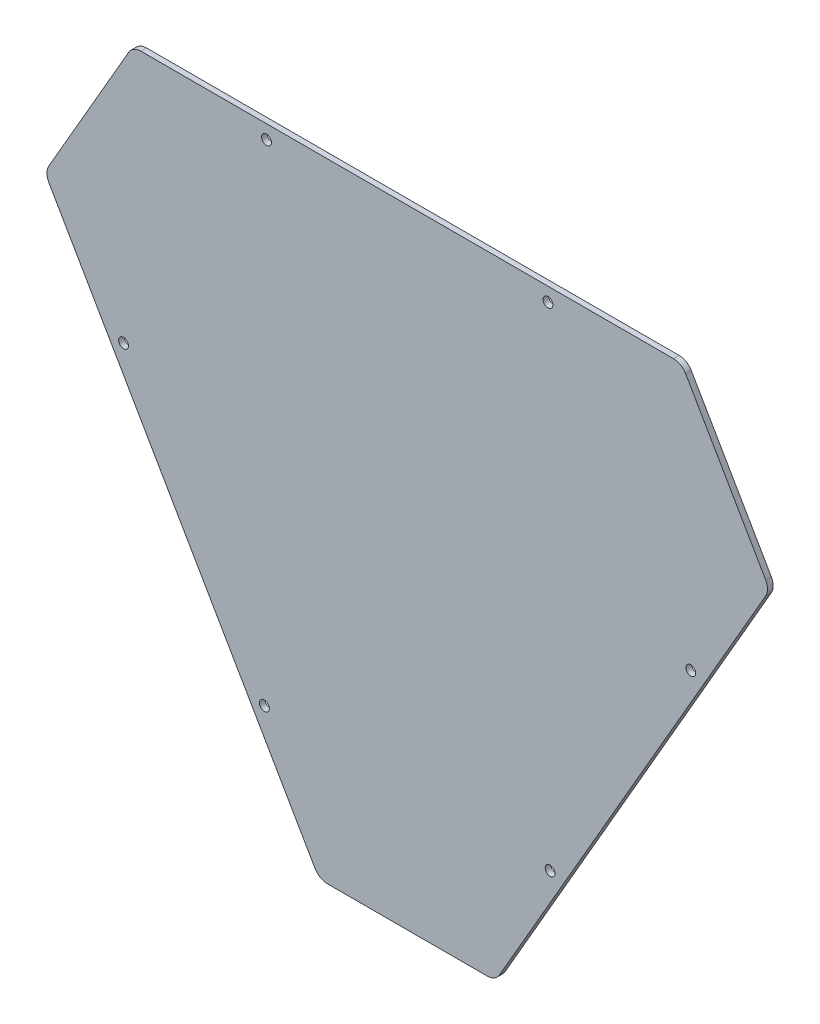
ISO-10303-21;
HEADER;
FILE_DESCRIPTION(('STEP AP214'),'2;1');
FILE_NAME('part.step','',(''),(''),'','','');
FILE_SCHEMA(('AUTOMOTIVE_DESIGN { 1 0 10303 214 1 1 1 1 }'));
ENDSEC;
DATA;
#1=APPLICATION_CONTEXT('core data for automotive mechanical design processes');
#2=APPLICATION_PROTOCOL_DEFINITION('international standard','automotive_design',2000,#1);
#3=PRODUCT_CONTEXT('',#1,'mechanical');
#4=PRODUCT('Part','Part','',(#3));
#5=PRODUCT_RELATED_PRODUCT_CATEGORY('part','',(#4));
#6=PRODUCT_DEFINITION_FORMATION('','',#4);
#7=PRODUCT_DEFINITION_CONTEXT('part definition',#1,'design');
#8=PRODUCT_DEFINITION('design','',#6,#7);
#9=PRODUCT_DEFINITION_SHAPE('','',#8);
#10=(LENGTH_UNIT() NAMED_UNIT(*) SI_UNIT(.MILLI.,.METRE.));
#11=(NAMED_UNIT(*) PLANE_ANGLE_UNIT() SI_UNIT($,.RADIAN.));
#12=(NAMED_UNIT(*) SI_UNIT($,.STERADIAN.) SOLID_ANGLE_UNIT());
#13=UNCERTAINTY_MEASURE_WITH_UNIT(LENGTH_MEASURE(1.E-05),#10,'distance_accuracy_value','');
#14=(GEOMETRIC_REPRESENTATION_CONTEXT(3) GLOBAL_UNCERTAINTY_ASSIGNED_CONTEXT((#13)) GLOBAL_UNIT_ASSIGNED_CONTEXT((#10,
#11,#12)) REPRESENTATION_CONTEXT('',''));
#15=CARTESIAN_POINT('',(0.,0.,0.));
#16=DIRECTION('',(0.,0.,1.));
#17=DIRECTION('',(1.,0.,0.));
#18=AXIS2_PLACEMENT_3D('',#15,#16,#17);
#19=CARTESIAN_POINT('',(-418.228215308054,-241.643380152117,4.));
#20=DIRECTION('',(0.865864704381755,0.500278236290463,0.));
#21=DIRECTION('',(-0.500278236290463,0.865864704381755,0.));
#22=AXIS2_PLACEMENT_3D('',#19,#20,#21);
#23=PLANE('',#22);
#24=DIRECTION('',(0.500278236290463,-0.865864704381755,0.));
#25=VECTOR('',#24,1.);
#26=CARTESIAN_POINT('',(-418.228215308054,-241.643380152117,0.));
#27=LINE('',#26,#25);
#28=CARTESIAN_POINT('',(-461.75987196409,-166.300256491142,0.));
#29=VERTEX_POINT('',#28);
#30=CARTESIAN_POINT('',(-367.110990814465,-330.115348877255,0.));
#31=VERTEX_POINT('',#30);
#32=EDGE_CURVE('E160',#29,#31,#27,.T.);
#33=ORIENTED_EDGE('',*,*,#32,.T.);
#34=DIRECTION('',(0.,0.,-1.));
#35=VECTOR('',#34,1.);
#36=CARTESIAN_POINT('',(-367.110990814465,-330.115348877255,4.));
#37=LINE('',#36,#35);
#38=CARTESIAN_POINT('',(-367.110990814465,-330.115348877255,4.));
#39=VERTEX_POINT('',#38);
#40=EDGE_CURVE('E148',#31,#39,#37,.F.);
#41=ORIENTED_EDGE('',*,*,#40,.T.);
#42=DIRECTION('',(0.500278236290463,-0.865864704381755,0.));
#43=VECTOR('',#42,1.);
#44=CARTESIAN_POINT('',(-418.228215308054,-241.643380152117,4.));
#45=LINE('',#44,#43);
#46=CARTESIAN_POINT('',(-461.75987196409,-166.300256491142,4.));
#47=VERTEX_POINT('',#46);
#48=EDGE_CURVE('E146',#47,#39,#45,.T.);
#49=ORIENTED_EDGE('',*,*,#48,.F.);
#50=DIRECTION('',(0.,0.,-1.));
#51=VECTOR('',#50,1.);
#52=CARTESIAN_POINT('',(-461.75987196409,-166.300256491142,4.));
#53=LINE('',#52,#51);
#54=EDGE_CURVE('E132',#47,#29,#53,.T.);
#55=ORIENTED_EDGE('',*,*,#54,.T.);
#56=EDGE_LOOP('',(#33,#41,#49,#55));
#57=FACE_BOUND('',#56,.T.);
#58=ADVANCED_FACE('F33',(#57),#23,.F.);
#59=CARTESIAN_POINT('',(8.17154408207809E-12,-335.112566514341,4.));
#60=DIRECTION('',(0.,1.,0.));
#61=DIRECTION('',(-1.,0.,0.));
#62=AXIS2_PLACEMENT_3D('',#59,#60,#61);
#63=PLANE('',#62);
#64=DIRECTION('',(1.,0.,0.));
#65=VECTOR('',#64,1.);
#66=CARTESIAN_POINT('',(8.17154408207809E-12,-335.112566514341,4.));
#67=LINE('',#66,#65);
#68=CARTESIAN_POINT('',(-358.452343770648,-335.11256651435,4.));
#69=VERTEX_POINT('',#68);
#70=CARTESIAN_POINT('',(-244.791018850483,-335.112566514347,4.));
#71=VERTEX_POINT('',#70);
#72=EDGE_CURVE('E150',#69,#71,#67,.T.);
#73=ORIENTED_EDGE('',*,*,#72,.F.);
#74=DIRECTION('',(0.,0.,-1.));
#75=VECTOR('',#74,1.);
#76=CARTESIAN_POINT('',(-358.452343770648,-335.11256651435,4.));
#77=LINE('',#76,#75);
#78=CARTESIAN_POINT('',(-358.452343770648,-335.11256651435,0.));
#79=VERTEX_POINT('',#78);
#80=EDGE_CURVE('E214',#69,#79,#77,.T.);
#81=ORIENTED_EDGE('',*,*,#80,.T.);
#82=DIRECTION('',(1.,0.,0.));
#83=VECTOR('',#82,1.);
#84=CARTESIAN_POINT('',(8.17154408207809E-12,-335.112566514341,0.));
#85=LINE('',#84,#83);
#86=CARTESIAN_POINT('',(-244.791018850483,-335.112566514347,0.));
#87=VERTEX_POINT('',#86);
#88=EDGE_CURVE('E162',#79,#87,#85,.T.);
#89=ORIENTED_EDGE('',*,*,#88,.T.);
#90=DIRECTION('',(0.,0.,-1.));
#91=VECTOR('',#90,1.);
#92=CARTESIAN_POINT('',(-244.791018850483,-335.112566514347,4.));
#93=LINE('',#92,#91);
#94=EDGE_CURVE('E212',#87,#71,#93,.F.);
#95=ORIENTED_EDGE('',*,*,#94,.T.);
#96=EDGE_LOOP('',(#73,#81,#89,#95));
#97=FACE_BOUND('',#96,.T.);
#98=ADVANCED_FACE('F288',(#97),#63,.F.);
#99=CARTESIAN_POINT('',(-34.2145081573532,19.7464278917968,4.));
#100=DIRECTION('',(-0.866105712512881,0.499860875396899,0.));
#101=DIRECTION('',(-0.499860875396899,-0.866105712512881,0.));
#102=AXIS2_PLACEMENT_3D('',#99,#100,#101);
#103=PLANE('',#102);
#104=DIRECTION('',(0.499860875396899,0.866105712512881,0.));
#105=VECTOR('',#104,1.);
#106=CARTESIAN_POINT('',(-34.2145081573532,19.7464278917968,4.));
#107=LINE('',#106,#105);
#108=CARTESIAN_POINT('',(-236.129961725354,-330.111175268316,4.));
#109=VERTEX_POINT('',#108);
#110=CARTESIAN_POINT('',(-46.9741927255163,-2.36219520372668,4.));
#111=VERTEX_POINT('',#110);
#112=EDGE_CURVE('E253',#109,#111,#107,.T.);
#113=ORIENTED_EDGE('',*,*,#112,.F.);
#114=DIRECTION('',(0.,0.,-1.));
#115=VECTOR('',#114,1.);
#116=CARTESIAN_POINT('',(-236.129961725354,-330.111175268316,4.));
#117=LINE('',#116,#115);
#118=CARTESIAN_POINT('',(-236.129961725354,-330.111175268316,0.));
#119=VERTEX_POINT('',#118);
#120=EDGE_CURVE('E220',#109,#119,#117,.T.);
#121=ORIENTED_EDGE('',*,*,#120,.T.);
#122=DIRECTION('',(0.499860875396899,0.866105712512881,0.));
#123=VECTOR('',#122,1.);
#124=CARTESIAN_POINT('',(-34.2145081573532,19.7464278917968,0.));
#125=LINE('',#124,#123);
#126=CARTESIAN_POINT('',(-46.9741927255163,-2.36219520372668,0.));
#127=VERTEX_POINT('',#126);
#128=EDGE_CURVE('E166',#119,#127,#125,.T.);
#129=ORIENTED_EDGE('',*,*,#128,.T.);
#130=DIRECTION('',(0.,0.,-1.));
#131=VECTOR('',#130,1.);
#132=CARTESIAN_POINT('',(-46.9741927255163,-2.36219520372668,4.));
#133=LINE('',#132,#131);
#134=EDGE_CURVE('E218',#127,#111,#133,.F.);
#135=ORIENTED_EDGE('',*,*,#134,.T.);
#136=EDGE_LOOP('',(#113,#121,#129,#135));
#137=FACE_BOUND('',#136,.T.);
#138=ADVANCED_FACE('F293',(#137),#103,.F.);
#139=CARTESIAN_POINT('',(-31.9245827954427,-18.4316664707163,4.));
#140=DIRECTION('',(-0.866025403784427,-0.500000000000021,0.));
#141=DIRECTION('',(0.500000000000021,-0.866025403784427,0.));
#142=AXIS2_PLACEMENT_3D('',#139,#140,#141);
#143=PLANE('',#142);
#144=DIRECTION('',(-0.500000000000021,0.866025403784427,0.));
#145=VECTOR('',#144,1.);
#146=CARTESIAN_POINT('',(-31.9245827954427,-18.4316664707163,4.));
#147=LINE('',#146,#145);
#148=CARTESIAN_POINT('',(-46.9749958128008,7.63641355024252,4.));
#149=VERTEX_POINT('',#148);
#150=CARTESIAN_POINT('',(-103.769490907328,106.00736464418,4.));
#151=VERTEX_POINT('',#150);
#152=EDGE_CURVE('E256',#149,#151,#147,.T.);
#153=ORIENTED_EDGE('',*,*,#152,.F.);
#154=DIRECTION('',(0.,0.,-1.));
#155=VECTOR('',#154,1.);
#156=CARTESIAN_POINT('',(-46.9749958128008,7.63641355024252,4.));
#157=LINE('',#156,#155);
#158=CARTESIAN_POINT('',(-46.9749958128008,7.63641355024252,0.));
#159=VERTEX_POINT('',#158);
#160=EDGE_CURVE('E11',#149,#159,#157,.T.);
#161=ORIENTED_EDGE('',*,*,#160,.T.);
#162=DIRECTION('',(-0.500000000000021,0.866025403784427,0.));
#163=VECTOR('',#162,1.);
#164=CARTESIAN_POINT('',(-31.9245827954427,-18.4316664707163,0.));
#165=LINE('',#164,#163);
#166=CARTESIAN_POINT('',(-103.769490907328,106.00736464418,0.));
#167=VERTEX_POINT('',#166);
#168=EDGE_CURVE('E169',#159,#167,#165,.T.);
#169=ORIENTED_EDGE('',*,*,#168,.T.);
#170=DIRECTION('',(0.,0.,-1.));
#171=VECTOR('',#170,1.);
#172=CARTESIAN_POINT('',(-103.769490907328,106.00736464418,4.));
#173=LINE('',#172,#171);
#174=EDGE_CURVE('E42',#167,#151,#173,.F.);
#175=ORIENTED_EDGE('',*,*,#174,.T.);
#176=EDGE_LOOP('',(#153,#161,#169,#175));
#177=FACE_BOUND('',#176,.T.);
#178=ADVANCED_FACE('F299',(#177),#143,.F.);
#179=CARTESIAN_POINT('',(0.,111.00736464418,4.));
#180=DIRECTION('',(0.,-1.,0.));
#181=DIRECTION('',(0.,0.,-1.));
#182=AXIS2_PLACEMENT_3D('',#179,#180,#181);
#183=PLANE('',#182);
#184=DIRECTION('',(-1.,0.,0.));
#185=VECTOR('',#184,1.);
#186=CARTESIAN_POINT('',(0.,111.00736464418,0.));
#187=LINE('',#186,#185);
#188=CARTESIAN_POINT('',(-112.429744945173,111.00736464418,0.));
#189=VERTEX_POINT('',#188);
#190=CARTESIAN_POINT('',(-490.882739561384,111.00736464418,0.));
#191=VERTEX_POINT('',#190);
#192=EDGE_CURVE('E171',#189,#191,#187,.T.);
#193=ORIENTED_EDGE('',*,*,#192,.T.);
#194=DIRECTION('',(0.,0.,-1.));
#195=VECTOR('',#194,1.);
#196=CARTESIAN_POINT('',(-490.882739561384,111.00736464418,4.));
#197=LINE('',#196,#195);
#198=CARTESIAN_POINT('',(-490.882739561384,111.00736464418,4.));
#199=VERTEX_POINT('',#198);
#200=EDGE_CURVE('E197',#191,#199,#197,.F.);
#201=ORIENTED_EDGE('',*,*,#200,.T.);
#202=DIRECTION('',(-1.,0.,0.));
#203=VECTOR('',#202,1.);
#204=CARTESIAN_POINT('',(0.,111.00736464418,4.));
#205=LINE('',#204,#203);
#206=CARTESIAN_POINT('',(-112.429744945173,111.00736464418,4.));
#207=VERTEX_POINT('',#206);
#208=EDGE_CURVE('E156',#207,#199,#205,.T.);
#209=ORIENTED_EDGE('',*,*,#208,.F.);
#210=DIRECTION('',(0.,0.,-1.));
#211=VECTOR('',#210,1.);
#212=CARTESIAN_POINT('',(-112.429744945173,111.00736464418,4.));
#213=LINE('',#212,#211);
#214=EDGE_CURVE('E194',#207,#189,#213,.T.);
#215=ORIENTED_EDGE('',*,*,#214,.T.);
#216=EDGE_LOOP('',(#193,#201,#209,#215));
#217=FACE_BOUND('',#216,.T.);
#218=ADVANCED_FACE('F303',(#217),#183,.F.);
#219=CARTESIAN_POINT('',(-420.559780584481,242.810302530766,4.));
#220=DIRECTION('',(0.86602540378445,-0.499999999999979,0.));
#221=DIRECTION('',(0.499999999999979,0.86602540378445,0.));
#222=AXIS2_PLACEMENT_3D('',#219,#220,#221);
#223=PLANE('',#222);
#224=DIRECTION('',(-0.499999999999979,-0.86602540378445,0.));
#225=VECTOR('',#224,1.);
#226=CARTESIAN_POINT('',(-420.559780584481,242.810302530766,4.));
#227=LINE('',#226,#225);
#228=CARTESIAN_POINT('',(-499.542993599229,106.00736464418,4.));
#229=VERTEX_POINT('',#228);
#230=CARTESIAN_POINT('',(-556.373120618142,7.57469724682344,4.));
#231=VERTEX_POINT('',#230);
#232=EDGE_CURVE('E154',#229,#231,#227,.T.);
#233=ORIENTED_EDGE('',*,*,#232,.F.);
#234=DIRECTION('',(0.,0.,-1.));
#235=VECTOR('',#234,1.);
#236=CARTESIAN_POINT('',(-499.542993599229,106.00736464418,4.));
#237=LINE('',#236,#235);
#238=CARTESIAN_POINT('',(-499.542993599229,106.00736464418,0.));
#239=VERTEX_POINT('',#238);
#240=EDGE_CURVE('E179',#229,#239,#237,.T.);
#241=ORIENTED_EDGE('',*,*,#240,.T.);
#242=DIRECTION('',(-0.499999999999979,-0.86602540378445,0.));
#243=VECTOR('',#242,1.);
#244=CARTESIAN_POINT('',(-420.559780584481,242.810302530766,0.));
#245=LINE('',#244,#243);
#246=CARTESIAN_POINT('',(-556.373120618142,7.57469724682344,0.));
#247=VERTEX_POINT('',#246);
#248=EDGE_CURVE('E174',#239,#247,#245,.T.);
#249=ORIENTED_EDGE('',*,*,#248,.T.);
#250=DIRECTION('',(0.,0.,-1.));
#251=VECTOR('',#250,1.);
#252=CARTESIAN_POINT('',(-556.373120618142,7.57469724682341,4.));
#253=LINE('',#252,#251);
#254=EDGE_CURVE('E143',#247,#231,#253,.F.);
#255=ORIENTED_EDGE('',*,*,#254,.T.);
#256=EDGE_LOOP('',(#233,#241,#249,#255));
#257=FACE_BOUND('',#256,.T.);
#258=ADVANCED_FACE('F269',(#257),#223,.F.);
#259=CARTESIAN_POINT('',(-418.330027361666,-241.522953907361,4.));
#260=DIRECTION('',(-0.866025403784439,-0.5,0.));
#261=DIRECTION('',(0.5,-0.866025403784439,0.));
#262=AXIS2_PLACEMENT_3D('',#259,#260,#261);
#263=PLANE('',#262);
#264=DIRECTION('',(-0.5,0.866025403784439,0.));
#265=VECTOR('',#264,1.);
#266=CARTESIAN_POINT('',(-418.330027361666,-241.522953907361,4.));
#267=LINE('',#266,#265);
#268=CARTESIAN_POINT('',(-556.373120618142,-2.42530275317632,4.));
#269=VERTEX_POINT('',#268);
#270=EDGE_CURVE('E136',#47,#269,#267,.T.);
#271=ORIENTED_EDGE('',*,*,#270,.T.);
#272=DIRECTION('',(0.,0.,-1.));
#273=VECTOR('',#272,1.);
#274=CARTESIAN_POINT('',(-556.373120618142,-2.42530275317635,0.));
#275=LINE('',#274,#273);
#276=CARTESIAN_POINT('',(-556.373120618142,-2.42530275317632,0.));
#277=VERTEX_POINT('',#276);
#278=EDGE_CURVE('E210',#269,#277,#275,.T.);
#279=ORIENTED_EDGE('',*,*,#278,.T.);
#280=DIRECTION('',(-0.5,0.866025403784439,0.));
#281=VECTOR('',#280,1.);
#282=CARTESIAN_POINT('',(-418.330027361666,-241.522953907361,0.));
#283=LINE('',#282,#281);
#284=EDGE_CURVE('E139',#29,#277,#283,.T.);
#285=ORIENTED_EDGE('',*,*,#284,.F.);
#286=ORIENTED_EDGE('',*,*,#54,.F.);
#287=EDGE_LOOP('',(#271,#279,#285,#286));
#288=FACE_BOUND('',#287,.T.);
#289=ADVANCED_FACE('F134',(#288),#263,.T.);
#290=CARTESIAN_POINT('',(0.,0.,4.));
#291=DIRECTION('',(0.,0.,1.));
#292=DIRECTION('',(1.,0.,0.));
#293=AXIS2_PLACEMENT_3D('',#290,#291,#292);
#294=PLANE('',#293);
#295=CARTESIAN_POINT('',(-503.182756728299,-74.746951028284,4.));
#296=DIRECTION('',(0.,0.,1.));
#297=DIRECTION('',(1.,0.,0.));
#298=AXIS2_PLACEMENT_3D('',#295,#296,#297);
#299=CIRCLE('',#298,3.49999999999996);
#300=CARTESIAN_POINT('',(-499.682756728299,-74.746951028284,4.));
#301=VERTEX_POINT('',#300);
#302=EDGE_CURVE('E231',#301,#301,#299,.T.);
#303=ORIENTED_EDGE('',*,*,#302,.F.);
#304=EDGE_LOOP('',(#303));
#305=FACE_BOUND('',#304,.T.);
#306=CARTESIAN_POINT('',(-401.661063496546,101.095842134571,4.));
#307=DIRECTION('',(0.,0.,1.));
#308=DIRECTION('',(1.,0.,0.));
#309=AXIS2_PLACEMENT_3D('',#306,#307,#308);
#310=CIRCLE('',#309,3.50000000000003);
#311=CARTESIAN_POINT('',(-398.161063496546,101.095842134571,4.));
#312=VERTEX_POINT('',#311);
#313=EDGE_CURVE('E342',#312,#312,#310,.T.);
#314=ORIENTED_EDGE('',*,*,#313,.F.);
#315=EDGE_LOOP('',(#314));
#316=FACE_BOUND('',#315,.T.);
#317=CARTESIAN_POINT('',(-201.661073820519,101.160104013997,4.));
#318=DIRECTION('',(0.,0.,1.));
#319=DIRECTION('',(1.,0.,0.));
#320=AXIS2_PLACEMENT_3D('',#317,#318,#319);
#321=CIRCLE('',#320,3.49999999999997);
#322=CARTESIAN_POINT('',(-198.161073820519,101.160104013997,4.));
#323=VERTEX_POINT('',#322);
#324=EDGE_CURVE('E345',#323,#323,#321,.T.);
#325=ORIENTED_EDGE('',*,*,#324,.F.);
#326=EDGE_LOOP('',(#325));
#327=FACE_BOUND('',#326,.T.);
#328=CARTESIAN_POINT('',(-100.137594484952,-74.6816579413394,4.));
#329=DIRECTION('',(0.,0.,1.));
#330=DIRECTION('',(1.,0.,0.));
#331=AXIS2_PLACEMENT_3D('',#328,#329,#330);
#332=CIRCLE('',#331,3.5);
#333=CARTESIAN_POINT('',(-96.6375944849519,-74.6816579413394,4.));
#334=VERTEX_POINT('',#333);
#335=EDGE_CURVE('E349',#334,#334,#332,.T.);
#336=ORIENTED_EDGE('',*,*,#335,.F.);
#337=EDGE_LOOP('',(#336));
#338=FACE_BOUND('',#337,.T.);
#339=CARTESIAN_POINT('',(-200.081936902888,-247.918860697117,4.));
#340=DIRECTION('',(0.,0.,1.));
#341=DIRECTION('',(1.,0.,0.));
#342=AXIS2_PLACEMENT_3D('',#339,#340,#341);
#343=CIRCLE('',#342,3.49999999999994);
#344=CARTESIAN_POINT('',(-196.581936902888,-247.918860697117,4.));
#345=VERTEX_POINT('',#344);
#346=EDGE_CURVE('E248',#345,#345,#343,.T.);
#347=ORIENTED_EDGE('',*,*,#346,.F.);
#348=EDGE_LOOP('',(#347));
#349=FACE_BOUND('',#348,.T.);
#350=CARTESIAN_POINT('',(-403.127109470207,-247.919891904635,4.));
#351=DIRECTION('',(0.,0.,1.));
#352=DIRECTION('',(1.,0.,0.));
#353=AXIS2_PLACEMENT_3D('',#350,#351,#352);
#354=CIRCLE('',#353,3.50000000000002);
#355=CARTESIAN_POINT('',(-399.627109470207,-247.919891904635,4.));
#356=VERTEX_POINT('',#355);
#357=EDGE_CURVE('E226',#356,#356,#354,.T.);
#358=ORIENTED_EDGE('',*,*,#357,.F.);
#359=EDGE_LOOP('',(#358));
#360=FACE_BOUND('',#359,.T.);
#361=ORIENTED_EDGE('',*,*,#208,.T.);
#362=CARTESIAN_POINT('',(-490.882739561384,101.00736464418,4.));
#363=DIRECTION('',(0.,0.,1.));
#364=DIRECTION('',(1.,0.,0.));
#365=AXIS2_PLACEMENT_3D('',#362,#363,#364);
#366=CIRCLE('',#365,10.);
#367=EDGE_CURVE('E208',#199,#229,#366,.T.);
#368=ORIENTED_EDGE('',*,*,#367,.T.);
#369=ORIENTED_EDGE('',*,*,#232,.T.);
#370=CARTESIAN_POINT('',(-547.712866580298,2.57469724682363,4.));
#371=DIRECTION('',(0.,0.,1.));
#372=DIRECTION('',(1.,0.,0.));
#373=AXIS2_PLACEMENT_3D('',#370,#371,#372);
#374=CIRCLE('',#373,10.);
#375=EDGE_CURVE('E50',#231,#269,#374,.T.);
#376=ORIENTED_EDGE('',*,*,#375,.T.);
#377=ORIENTED_EDGE('',*,*,#270,.F.);
#378=ORIENTED_EDGE('',*,*,#48,.T.);
#379=CARTESIAN_POINT('',(-358.452343770648,-325.11256651435,4.));
#380=DIRECTION('',(0.,0.,1.));
#381=DIRECTION('',(1.,0.,0.));
#382=AXIS2_PLACEMENT_3D('',#379,#380,#381);
#383=CIRCLE('',#382,10.);
#384=EDGE_CURVE('E205',#39,#69,#383,.T.);
#385=ORIENTED_EDGE('',*,*,#384,.T.);
#386=ORIENTED_EDGE('',*,*,#72,.T.);
#387=CARTESIAN_POINT('',(-244.791018850483,-325.112566514347,4.));
#388=DIRECTION('',(0.,0.,1.));
#389=DIRECTION('',(1.,0.,0.));
#390=AXIS2_PLACEMENT_3D('',#387,#388,#389);
#391=CIRCLE('',#390,10.);
#392=EDGE_CURVE('E203',#71,#109,#391,.T.);
#393=ORIENTED_EDGE('',*,*,#392,.T.);
#394=ORIENTED_EDGE('',*,*,#112,.T.);
#395=CARTESIAN_POINT('',(-55.6352498506451,2.63641355024231,4.));
#396=DIRECTION('',(0.,0.,1.));
#397=DIRECTION('',(1.,0.,0.));
#398=AXIS2_PLACEMENT_3D('',#395,#396,#397);
#399=CIRCLE('',#398,10.);
#400=EDGE_CURVE('E201',#111,#149,#399,.T.);
#401=ORIENTED_EDGE('',*,*,#400,.T.);
#402=ORIENTED_EDGE('',*,*,#152,.T.);
#403=CARTESIAN_POINT('',(-112.429744945173,101.00736464418,4.));
#404=DIRECTION('',(0.,0.,1.));
#405=DIRECTION('',(1.,0.,0.));
#406=AXIS2_PLACEMENT_3D('',#403,#404,#405);
#407=CIRCLE('',#406,10.);
#408=EDGE_CURVE('E199',#151,#207,#407,.T.);
#409=ORIENTED_EDGE('',*,*,#408,.T.);
#410=EDGE_LOOP('',(#361,#368,#369,#376,#377,#378,#385,#386,#393,#394,#401,#402,#409));
#411=FACE_BOUND('',#410,.T.);
#412=ADVANCED_FACE('F153',(#305,#316,#327,#338,#349,#360,#411),#294,.T.);
#413=CARTESIAN_POINT('',(0.,0.,0.));
#414=DIRECTION('',(0.,0.,1.));
#415=DIRECTION('',(1.,0.,0.));
#416=AXIS2_PLACEMENT_3D('',#413,#414,#415);
#417=PLANE('',#416);
#418=CARTESIAN_POINT('',(-503.182756728299,-74.746951028284,0.));
#419=DIRECTION('',(0.,0.,1.));
#420=DIRECTION('',(1.,0.,0.));
#421=AXIS2_PLACEMENT_3D('',#418,#419,#420);
#422=CIRCLE('',#421,3.49999999999996);
#423=CARTESIAN_POINT('',(-499.682756728299,-74.746951028284,0.));
#424=VERTEX_POINT('',#423);
#425=EDGE_CURVE('E37',#424,#424,#422,.T.);
#426=ORIENTED_EDGE('',*,*,#425,.T.);
#427=EDGE_LOOP('',(#426));
#428=FACE_BOUND('',#427,.T.);
#429=CARTESIAN_POINT('',(-401.661063496546,101.095842134571,0.));
#430=DIRECTION('',(0.,0.,1.));
#431=DIRECTION('',(1.,0.,0.));
#432=AXIS2_PLACEMENT_3D('',#429,#430,#431);
#433=CIRCLE('',#432,3.50000000000003);
#434=CARTESIAN_POINT('',(-398.161063496546,101.095842134571,0.));
#435=VERTEX_POINT('',#434);
#436=EDGE_CURVE('E236',#435,#435,#433,.T.);
#437=ORIENTED_EDGE('',*,*,#436,.T.);
#438=EDGE_LOOP('',(#437));
#439=FACE_BOUND('',#438,.T.);
#440=CARTESIAN_POINT('',(-201.661073820519,101.160104013997,0.));
#441=DIRECTION('',(0.,0.,1.));
#442=DIRECTION('',(1.,0.,0.));
#443=AXIS2_PLACEMENT_3D('',#440,#441,#442);
#444=CIRCLE('',#443,3.49999999999997);
#445=CARTESIAN_POINT('',(-198.161073820519,101.160104013997,0.));
#446=VERTEX_POINT('',#445);
#447=EDGE_CURVE('E234',#446,#446,#444,.T.);
#448=ORIENTED_EDGE('',*,*,#447,.T.);
#449=EDGE_LOOP('',(#448));
#450=FACE_BOUND('',#449,.T.);
#451=CARTESIAN_POINT('',(-100.137594484952,-74.6816579413394,0.));
#452=DIRECTION('',(0.,0.,1.));
#453=DIRECTION('',(1.,0.,0.));
#454=AXIS2_PLACEMENT_3D('',#451,#452,#453);
#455=CIRCLE('',#454,3.5);
#456=CARTESIAN_POINT('',(-96.6375944849519,-74.6816579413394,0.));
#457=VERTEX_POINT('',#456);
#458=EDGE_CURVE('E230',#457,#457,#455,.T.);
#459=ORIENTED_EDGE('',*,*,#458,.T.);
#460=EDGE_LOOP('',(#459));
#461=FACE_BOUND('',#460,.T.);
#462=CARTESIAN_POINT('',(-200.081936902888,-247.918860697117,0.));
#463=DIRECTION('',(0.,0.,1.));
#464=DIRECTION('',(1.,0.,0.));
#465=AXIS2_PLACEMENT_3D('',#462,#463,#464);
#466=CIRCLE('',#465,3.49999999999994);
#467=CARTESIAN_POINT('',(-196.581936902888,-247.918860697117,0.));
#468=VERTEX_POINT('',#467);
#469=EDGE_CURVE('E227',#468,#468,#466,.T.);
#470=ORIENTED_EDGE('',*,*,#469,.T.);
#471=EDGE_LOOP('',(#470));
#472=FACE_BOUND('',#471,.T.);
#473=CARTESIAN_POINT('',(-403.127109470207,-247.919891904635,0.));
#474=DIRECTION('',(0.,0.,1.));
#475=DIRECTION('',(1.,0.,0.));
#476=AXIS2_PLACEMENT_3D('',#473,#474,#475);
#477=CIRCLE('',#476,3.50000000000002);
#478=CARTESIAN_POINT('',(-399.627109470207,-247.919891904635,0.));
#479=VERTEX_POINT('',#478);
#480=EDGE_CURVE('E163',#479,#479,#477,.T.);
#481=ORIENTED_EDGE('',*,*,#480,.T.);
#482=EDGE_LOOP('',(#481));
#483=FACE_BOUND('',#482,.T.);
#484=ORIENTED_EDGE('',*,*,#248,.F.);
#485=CARTESIAN_POINT('',(-490.882739561384,101.00736464418,0.));
#486=DIRECTION('',(0.,0.,1.));
#487=DIRECTION('',(1.,0.,0.));
#488=AXIS2_PLACEMENT_3D('',#485,#486,#487);
#489=CIRCLE('',#488,10.);
#490=EDGE_CURVE('E192',#239,#191,#489,.F.);
#491=ORIENTED_EDGE('',*,*,#490,.T.);
#492=ORIENTED_EDGE('',*,*,#192,.F.);
#493=CARTESIAN_POINT('',(-112.429744945173,101.00736464418,0.));
#494=DIRECTION('',(0.,0.,1.));
#495=DIRECTION('',(1.,0.,0.));
#496=AXIS2_PLACEMENT_3D('',#493,#494,#495);
#497=CIRCLE('',#496,10.);
#498=EDGE_CURVE('E182',#189,#167,#497,.F.);
#499=ORIENTED_EDGE('',*,*,#498,.T.);
#500=ORIENTED_EDGE('',*,*,#168,.F.);
#501=CARTESIAN_POINT('',(-55.6352498506451,2.63641355024231,0.));
#502=DIRECTION('',(0.,0.,1.));
#503=DIRECTION('',(1.,0.,0.));
#504=AXIS2_PLACEMENT_3D('',#501,#502,#503);
#505=CIRCLE('',#504,10.);
#506=EDGE_CURVE('E184',#159,#127,#505,.F.);
#507=ORIENTED_EDGE('',*,*,#506,.T.);
#508=ORIENTED_EDGE('',*,*,#128,.F.);
#509=CARTESIAN_POINT('',(-244.791018850483,-325.112566514347,0.));
#510=DIRECTION('',(0.,0.,1.));
#511=DIRECTION('',(1.,0.,0.));
#512=AXIS2_PLACEMENT_3D('',#509,#510,#511);
#513=CIRCLE('',#512,10.);
#514=EDGE_CURVE('E186',#119,#87,#513,.F.);
#515=ORIENTED_EDGE('',*,*,#514,.T.);
#516=ORIENTED_EDGE('',*,*,#88,.F.);
#517=CARTESIAN_POINT('',(-358.452343770648,-325.11256651435,0.));
#518=DIRECTION('',(0.,0.,1.));
#519=DIRECTION('',(1.,0.,0.));
#520=AXIS2_PLACEMENT_3D('',#517,#518,#519);
#521=CIRCLE('',#520,10.);
#522=EDGE_CURVE('E188',#79,#31,#521,.F.);
#523=ORIENTED_EDGE('',*,*,#522,.T.);
#524=ORIENTED_EDGE('',*,*,#32,.F.);
#525=ORIENTED_EDGE('',*,*,#284,.T.);
#526=CARTESIAN_POINT('',(-547.712866580298,2.57469724682363,0.));
#527=DIRECTION('',(0.,0.,1.));
#528=DIRECTION('',(1.,0.,0.));
#529=AXIS2_PLACEMENT_3D('',#526,#527,#528);
#530=CIRCLE('',#529,10.);
#531=EDGE_CURVE('E190',#277,#247,#530,.F.);
#532=ORIENTED_EDGE('',*,*,#531,.T.);
#533=EDGE_LOOP('',(#484,#491,#492,#499,#500,#507,#508,#515,#516,#523,#524,#525,#532));
#534=FACE_BOUND('',#533,.T.);
#535=ADVANCED_FACE('F272',(#428,#439,#450,#461,#472,#483,#534),#417,.F.);
#536=CARTESIAN_POINT('',(-490.882739561384,101.00736464418,4.));
#537=DIRECTION('',(0.,0.,-1.));
#538=DIRECTION('',(-1.,0.,0.));
#539=AXIS2_PLACEMENT_3D('',#536,#537,#538);
#540=CYLINDRICAL_SURFACE('',#539,10.);
#541=ORIENTED_EDGE('',*,*,#367,.F.);
#542=ORIENTED_EDGE('',*,*,#200,.F.);
#543=ORIENTED_EDGE('',*,*,#490,.F.);
#544=ORIENTED_EDGE('',*,*,#240,.F.);
#545=EDGE_LOOP('',(#541,#542,#543,#544));
#546=FACE_BOUND('',#545,.T.);
#547=ADVANCED_FACE('F266',(#546),#540,.T.);
#548=CARTESIAN_POINT('',(-547.712866580298,2.57469724682363,4.));
#549=DIRECTION('',(0.,0.,1.));
#550=DIRECTION('',(1.,0.,0.));
#551=AXIS2_PLACEMENT_3D('',#548,#549,#550);
#552=CYLINDRICAL_SURFACE('',#551,10.);
#553=ORIENTED_EDGE('',*,*,#375,.F.);
#554=ORIENTED_EDGE('',*,*,#254,.F.);
#555=ORIENTED_EDGE('',*,*,#531,.F.);
#556=ORIENTED_EDGE('',*,*,#278,.F.);
#557=EDGE_LOOP('',(#553,#554,#555,#556));
#558=FACE_BOUND('',#557,.T.);
#559=ADVANCED_FACE('F275',(#558),#552,.T.);
#560=CARTESIAN_POINT('',(-358.452343770648,-325.11256651435,4.));
#561=DIRECTION('',(0.,0.,-1.));
#562=DIRECTION('',(-1.,0.,0.));
#563=AXIS2_PLACEMENT_3D('',#560,#561,#562);
#564=CYLINDRICAL_SURFACE('',#563,10.);
#565=ORIENTED_EDGE('',*,*,#384,.F.);
#566=ORIENTED_EDGE('',*,*,#40,.F.);
#567=ORIENTED_EDGE('',*,*,#522,.F.);
#568=ORIENTED_EDGE('',*,*,#80,.F.);
#569=EDGE_LOOP('',(#565,#566,#567,#568));
#570=FACE_BOUND('',#569,.T.);
#571=ADVANCED_FACE('F277',(#570),#564,.T.);
#572=CARTESIAN_POINT('',(-244.791018850483,-325.112566514347,4.));
#573=DIRECTION('',(0.,0.,-1.));
#574=DIRECTION('',(-1.,0.,0.));
#575=AXIS2_PLACEMENT_3D('',#572,#573,#574);
#576=CYLINDRICAL_SURFACE('',#575,10.);
#577=ORIENTED_EDGE('',*,*,#392,.F.);
#578=ORIENTED_EDGE('',*,*,#94,.F.);
#579=ORIENTED_EDGE('',*,*,#514,.F.);
#580=ORIENTED_EDGE('',*,*,#120,.F.);
#581=EDGE_LOOP('',(#577,#578,#579,#580));
#582=FACE_BOUND('',#581,.T.);
#583=ADVANCED_FACE('F283',(#582),#576,.T.);
#584=CARTESIAN_POINT('',(-55.6352498506451,2.63641355024231,4.));
#585=DIRECTION('',(0.,0.,-1.));
#586=DIRECTION('',(-1.,0.,0.));
#587=AXIS2_PLACEMENT_3D('',#584,#585,#586);
#588=CYLINDRICAL_SURFACE('',#587,10.);
#589=ORIENTED_EDGE('',*,*,#400,.F.);
#590=ORIENTED_EDGE('',*,*,#134,.F.);
#591=ORIENTED_EDGE('',*,*,#506,.F.);
#592=ORIENTED_EDGE('',*,*,#160,.F.);
#593=EDGE_LOOP('',(#589,#590,#591,#592));
#594=FACE_BOUND('',#593,.T.);
#595=ADVANCED_FACE('F401',(#594),#588,.T.);
#596=CARTESIAN_POINT('',(-112.429744945173,101.00736464418,4.));
#597=DIRECTION('',(0.,0.,-1.));
#598=DIRECTION('',(-1.,0.,0.));
#599=AXIS2_PLACEMENT_3D('',#596,#597,#598);
#600=CYLINDRICAL_SURFACE('',#599,10.);
#601=ORIENTED_EDGE('',*,*,#408,.F.);
#602=ORIENTED_EDGE('',*,*,#174,.F.);
#603=ORIENTED_EDGE('',*,*,#498,.F.);
#604=ORIENTED_EDGE('',*,*,#214,.F.);
#605=EDGE_LOOP('',(#601,#602,#603,#604));
#606=FACE_BOUND('',#605,.T.);
#607=ADVANCED_FACE('F35',(#606),#600,.T.);
#608=CARTESIAN_POINT('',(-403.127109470207,-247.919891904635,-6.));
#609=DIRECTION('',(0.,0.,1.));
#610=DIRECTION('',(1.,0.,0.));
#611=AXIS2_PLACEMENT_3D('',#608,#609,#610);
#612=CYLINDRICAL_SURFACE('',#611,3.50000000000002);
#613=ORIENTED_EDGE('',*,*,#357,.T.);
#614=EDGE_LOOP('',(#613));
#615=FACE_BOUND('',#614,.T.);
#616=ORIENTED_EDGE('',*,*,#480,.F.);
#617=EDGE_LOOP('',(#616));
#618=FACE_BOUND('',#617,.T.);
#619=ADVANCED_FACE('F315',(#615,#618),#612,.F.);
#620=CARTESIAN_POINT('',(-200.081936902888,-247.918860697117,-6.));
#621=DIRECTION('',(0.,0.,1.));
#622=DIRECTION('',(1.,0.,0.));
#623=AXIS2_PLACEMENT_3D('',#620,#621,#622);
#624=CYLINDRICAL_SURFACE('',#623,3.49999999999994);
#625=ORIENTED_EDGE('',*,*,#346,.T.);
#626=EDGE_LOOP('',(#625));
#627=FACE_BOUND('',#626,.T.);
#628=ORIENTED_EDGE('',*,*,#469,.F.);
#629=EDGE_LOOP('',(#628));
#630=FACE_BOUND('',#629,.T.);
#631=ADVANCED_FACE('F318',(#627,#630),#624,.F.);
#632=CARTESIAN_POINT('',(-100.137594484952,-74.6816579413394,-6.));
#633=DIRECTION('',(0.,0.,1.));
#634=DIRECTION('',(1.,0.,0.));
#635=AXIS2_PLACEMENT_3D('',#632,#633,#634);
#636=CYLINDRICAL_SURFACE('',#635,3.5);
#637=ORIENTED_EDGE('',*,*,#335,.T.);
#638=EDGE_LOOP('',(#637));
#639=FACE_BOUND('',#638,.T.);
#640=ORIENTED_EDGE('',*,*,#458,.F.);
#641=EDGE_LOOP('',(#640));
#642=FACE_BOUND('',#641,.T.);
#643=ADVANCED_FACE('F321',(#639,#642),#636,.F.);
#644=CARTESIAN_POINT('',(-201.661073820519,101.160104013997,-6.));
#645=DIRECTION('',(0.,0.,1.));
#646=DIRECTION('',(1.,0.,0.));
#647=AXIS2_PLACEMENT_3D('',#644,#645,#646);
#648=CYLINDRICAL_SURFACE('',#647,3.49999999999997);
#649=ORIENTED_EDGE('',*,*,#324,.T.);
#650=EDGE_LOOP('',(#649));
#651=FACE_BOUND('',#650,.T.);
#652=ORIENTED_EDGE('',*,*,#447,.F.);
#653=EDGE_LOOP('',(#652));
#654=FACE_BOUND('',#653,.T.);
#655=ADVANCED_FACE('F325',(#651,#654),#648,.F.);
#656=CARTESIAN_POINT('',(-401.661063496546,101.095842134571,-6.));
#657=DIRECTION('',(0.,0.,1.));
#658=DIRECTION('',(1.,0.,0.));
#659=AXIS2_PLACEMENT_3D('',#656,#657,#658);
#660=CYLINDRICAL_SURFACE('',#659,3.50000000000003);
#661=ORIENTED_EDGE('',*,*,#313,.T.);
#662=EDGE_LOOP('',(#661));
#663=FACE_BOUND('',#662,.T.);
#664=ORIENTED_EDGE('',*,*,#436,.F.);
#665=EDGE_LOOP('',(#664));
#666=FACE_BOUND('',#665,.T.);
#667=ADVANCED_FACE('F329',(#663,#666),#660,.F.);
#668=CARTESIAN_POINT('',(-503.182756728299,-74.746951028284,-6.));
#669=DIRECTION('',(0.,0.,1.));
#670=DIRECTION('',(1.,0.,0.));
#671=AXIS2_PLACEMENT_3D('',#668,#669,#670);
#672=CYLINDRICAL_SURFACE('',#671,3.49999999999996);
#673=ORIENTED_EDGE('',*,*,#302,.T.);
#674=EDGE_LOOP('',(#673));
#675=FACE_BOUND('',#674,.T.);
#676=ORIENTED_EDGE('',*,*,#425,.F.);
#677=EDGE_LOOP('',(#676));
#678=FACE_BOUND('',#677,.T.);
#679=ADVANCED_FACE('F333',(#675,#678),#672,.F.);
#680=CLOSED_SHELL('',(#58,#98,#138,#178,#218,#258,#289,#412,#535,#547,#559,#571,#583,#595,#607,
#619,#631,#643,#655,#667,#679));
#681=MANIFOLD_SOLID_BREP('B2',#680);
#682=ADVANCED_BREP_SHAPE_REPRESENTATION('',(#18,#681),#14);
#683=SHAPE_DEFINITION_REPRESENTATION(#9,#682);
ENDSEC;
END-ISO-10303-21;
